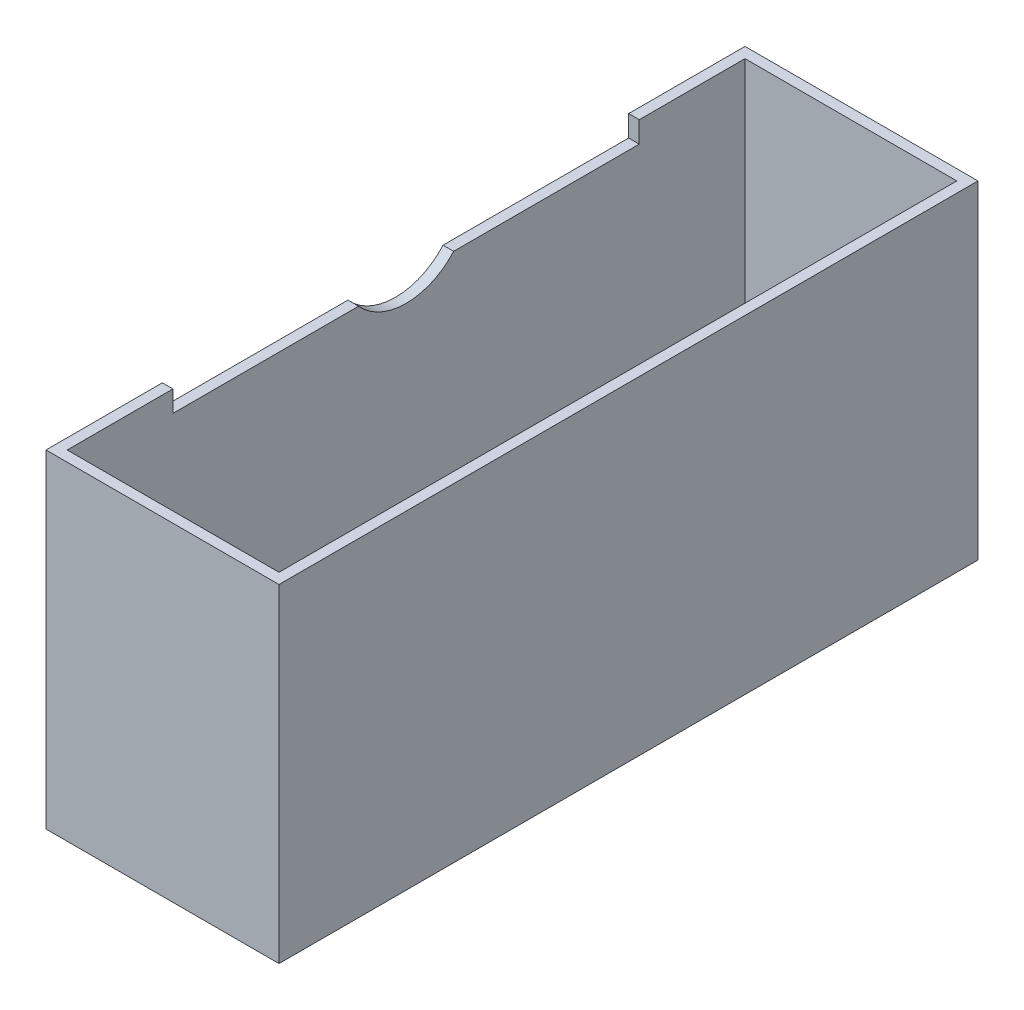
ISO-10303-21;
HEADER;
FILE_DESCRIPTION(('STEP AP214'),'2;1');
FILE_NAME('part.step','',(''),(''),'','','');
FILE_SCHEMA(('AUTOMOTIVE_DESIGN { 1 0 10303 214 1 1 1 1 }'));
ENDSEC;
DATA;
#1=APPLICATION_CONTEXT('core data for automotive mechanical design processes');
#2=APPLICATION_PROTOCOL_DEFINITION('international standard','automotive_design',2000,#1);
#3=PRODUCT_CONTEXT('',#1,'mechanical');
#4=PRODUCT('Part','Part','',(#3));
#5=PRODUCT_RELATED_PRODUCT_CATEGORY('part','',(#4));
#6=PRODUCT_DEFINITION_FORMATION('','',#4);
#7=PRODUCT_DEFINITION_CONTEXT('part definition',#1,'design');
#8=PRODUCT_DEFINITION('design','',#6,#7);
#9=PRODUCT_DEFINITION_SHAPE('','',#8);
#10=(LENGTH_UNIT() NAMED_UNIT(*) SI_UNIT(.MILLI.,.METRE.));
#11=(NAMED_UNIT(*) PLANE_ANGLE_UNIT() SI_UNIT($,.RADIAN.));
#12=(NAMED_UNIT(*) SI_UNIT($,.STERADIAN.) SOLID_ANGLE_UNIT());
#13=UNCERTAINTY_MEASURE_WITH_UNIT(LENGTH_MEASURE(1.E-05),#10,'distance_accuracy_value','');
#14=(GEOMETRIC_REPRESENTATION_CONTEXT(3) GLOBAL_UNCERTAINTY_ASSIGNED_CONTEXT((#13)) GLOBAL_UNIT_ASSIGNED_CONTEXT((#10,
#11,#12)) REPRESENTATION_CONTEXT('',''));
#15=CARTESIAN_POINT('',(0.,0.,0.));
#16=DIRECTION('',(0.,0.,1.));
#17=DIRECTION('',(1.,0.,0.));
#18=AXIS2_PLACEMENT_3D('',#15,#16,#17);
#19=CARTESIAN_POINT('',(34.925,98.425,-104.775));
#20=DIRECTION('',(-1.,0.,0.));
#21=DIRECTION('',(0.,0.,1.));
#22=AXIS2_PLACEMENT_3D('',#19,#20,#21);
#23=PLANE('',#22);
#24=DIRECTION('',(0.,0.,-1.));
#25=VECTOR('',#24,1.);
#26=CARTESIAN_POINT('',(34.925,0.,-104.775));
#27=LINE('',#26,#25);
#28=CARTESIAN_POINT('',(34.9250000000001,0.,104.775));
#29=VERTEX_POINT('',#28);
#30=CARTESIAN_POINT('',(34.925,0.,-104.775));
#31=VERTEX_POINT('',#30);
#32=EDGE_CURVE('E236',#29,#31,#27,.T.);
#33=ORIENTED_EDGE('',*,*,#32,.T.);
#34=DIRECTION('',(0.,-1.,0.));
#35=VECTOR('',#34,1.);
#36=CARTESIAN_POINT('',(34.925,98.425,-104.775));
#37=LINE('',#36,#35);
#38=CARTESIAN_POINT('',(34.925,98.425,-104.775));
#39=VERTEX_POINT('',#38);
#40=EDGE_CURVE('E49',#39,#31,#37,.T.);
#41=ORIENTED_EDGE('',*,*,#40,.F.);
#42=DIRECTION('',(0.,0.,-1.));
#43=VECTOR('',#42,1.);
#44=CARTESIAN_POINT('',(34.925,98.425,-104.775));
#45=LINE('',#44,#43);
#46=CARTESIAN_POINT('',(34.9250000000001,98.425,104.775));
#47=VERTEX_POINT('',#46);
#48=EDGE_CURVE('E237',#47,#39,#45,.T.);
#49=ORIENTED_EDGE('',*,*,#48,.F.);
#50=DIRECTION('',(0.,-1.,0.));
#51=VECTOR('',#50,1.);
#52=CARTESIAN_POINT('',(34.9250000000001,98.425,104.775));
#53=LINE('',#52,#51);
#54=EDGE_CURVE('E252',#47,#29,#53,.T.);
#55=ORIENTED_EDGE('',*,*,#54,.T.);
#56=EDGE_LOOP('',(#33,#41,#49,#55));
#57=FACE_BOUND('',#56,.T.);
#58=ADVANCED_FACE('F41',(#57),#23,.F.);
#59=CARTESIAN_POINT('',(-34.925,98.425,-104.775));
#60=DIRECTION('',(0.,0.,1.));
#61=DIRECTION('',(1.,0.,0.));
#62=AXIS2_PLACEMENT_3D('',#59,#60,#61);
#63=PLANE('',#62);
#64=DIRECTION('',(-1.,0.,0.));
#65=VECTOR('',#64,1.);
#66=CARTESIAN_POINT('',(-34.925,0.,-104.775));
#67=LINE('',#66,#65);
#68=CARTESIAN_POINT('',(-34.925,0.,-104.775));
#69=VERTEX_POINT('',#68);
#70=EDGE_CURVE('E256',#31,#69,#67,.T.);
#71=ORIENTED_EDGE('',*,*,#70,.T.);
#72=DIRECTION('',(0.,-1.,0.));
#73=VECTOR('',#72,1.);
#74=CARTESIAN_POINT('',(-34.925,98.425,-104.775));
#75=LINE('',#74,#73);
#76=CARTESIAN_POINT('',(-34.925,98.425,-104.775));
#77=VERTEX_POINT('',#76);
#78=EDGE_CURVE('E271',#77,#69,#75,.T.);
#79=ORIENTED_EDGE('',*,*,#78,.F.);
#80=DIRECTION('',(-1.,0.,0.));
#81=VECTOR('',#80,1.);
#82=CARTESIAN_POINT('',(-34.925,98.425,-104.775));
#83=LINE('',#82,#81);
#84=EDGE_CURVE('E241',#39,#77,#83,.T.);
#85=ORIENTED_EDGE('',*,*,#84,.F.);
#86=ORIENTED_EDGE('',*,*,#40,.T.);
#87=EDGE_LOOP('',(#71,#79,#85,#86));
#88=FACE_BOUND('',#87,.T.);
#89=ADVANCED_FACE('F278',(#88),#63,.F.);
#90=CARTESIAN_POINT('',(-34.925,98.425,-104.775));
#91=DIRECTION('',(1.,0.,0.));
#92=DIRECTION('',(0.,0.,-1.));
#93=AXIS2_PLACEMENT_3D('',#90,#91,#92);
#94=PLANE('',#93);
#95=DIRECTION('',(0.,0.,1.));
#96=VECTOR('',#95,1.);
#97=CARTESIAN_POINT('',(-34.925,98.425,-104.775));
#98=LINE('',#97,#96);
#99=CARTESIAN_POINT('',(-34.9249999999999,98.425,69.8969947717208));
#100=VERTEX_POINT('',#99);
#101=CARTESIAN_POINT('',(-34.9249999999999,98.425,104.775));
#102=VERTEX_POINT('',#101);
#103=EDGE_CURVE('E245',#100,#102,#98,.T.);
#104=ORIENTED_EDGE('',*,*,#103,.F.);
#105=DIRECTION('',(0.,1.,0.));
#106=VECTOR('',#105,1.);
#107=CARTESIAN_POINT('',(-34.9249999999999,92.075,69.8969947717208));
#108=LINE('',#107,#106);
#109=CARTESIAN_POINT('',(-34.9249999999999,92.075,69.8969947717208));
#110=VERTEX_POINT('',#109);
#111=EDGE_CURVE('E162',#110,#100,#108,.T.);
#112=ORIENTED_EDGE('',*,*,#111,.F.);
#113=DIRECTION('',(0.,0.,1.));
#114=VECTOR('',#113,1.);
#115=CARTESIAN_POINT('',(-34.925,92.075,14.2460264288444));
#116=LINE('',#115,#114);
#117=CARTESIAN_POINT('',(-34.925,92.075,14.2460264288444));
#118=VERTEX_POINT('',#117);
#119=EDGE_CURVE('E172',#118,#110,#116,.T.);
#120=ORIENTED_EDGE('',*,*,#119,.F.);
#121=CARTESIAN_POINT('',(-34.925,104.72226179806,0.));
#122=DIRECTION('',(-1.,0.,0.));
#123=DIRECTION('',(0.,0.,1.));
#124=AXIS2_PLACEMENT_3D('',#121,#122,#123);
#125=CIRCLE('',#124,19.05);
#126=CARTESIAN_POINT('',(-34.925,92.075,-14.2460264288444));
#127=VERTEX_POINT('',#126);
#128=EDGE_CURVE('E168',#127,#118,#125,.T.);
#129=ORIENTED_EDGE('',*,*,#128,.F.);
#130=DIRECTION('',(0.,0.,1.));
#131=VECTOR('',#130,1.);
#132=CARTESIAN_POINT('',(-34.925,92.075,-69.8969947717208));
#133=LINE('',#132,#131);
#134=CARTESIAN_POINT('',(-34.925,92.075,-69.8969947717208));
#135=VERTEX_POINT('',#134);
#136=EDGE_CURVE('E150',#135,#127,#133,.T.);
#137=ORIENTED_EDGE('',*,*,#136,.F.);
#138=DIRECTION('',(0.,-1.,0.));
#139=VECTOR('',#138,1.);
#140=CARTESIAN_POINT('',(-34.925,98.425,-69.8969947717208));
#141=LINE('',#140,#139);
#142=CARTESIAN_POINT('',(-34.925,98.425,-69.8969947717208));
#143=VERTEX_POINT('',#142);
#144=EDGE_CURVE('E141',#143,#135,#141,.T.);
#145=ORIENTED_EDGE('',*,*,#144,.F.);
#146=EDGE_CURVE('E246',#77,#143,#98,.T.);
#147=ORIENTED_EDGE('',*,*,#146,.F.);
#148=ORIENTED_EDGE('',*,*,#78,.T.);
#149=DIRECTION('',(0.,0.,1.));
#150=VECTOR('',#149,1.);
#151=CARTESIAN_POINT('',(-34.925,0.,-104.775));
#152=LINE('',#151,#150);
#153=CARTESIAN_POINT('',(-34.9249999999999,0.,104.775));
#154=VERTEX_POINT('',#153);
#155=EDGE_CURVE('E259',#69,#154,#152,.T.);
#156=ORIENTED_EDGE('',*,*,#155,.T.);
#157=DIRECTION('',(0.,-1.,0.));
#158=VECTOR('',#157,1.);
#159=CARTESIAN_POINT('',(-34.9249999999999,98.425,104.775));
#160=LINE('',#159,#158);
#161=EDGE_CURVE('E267',#102,#154,#160,.T.);
#162=ORIENTED_EDGE('',*,*,#161,.F.);
#163=EDGE_LOOP('',(#104,#112,#120,#129,#137,#145,#147,#148,#156,#162));
#164=FACE_BOUND('',#163,.T.);
#165=ADVANCED_FACE('F165',(#164),#94,.F.);
#166=CARTESIAN_POINT('',(-34.9249999999999,98.425,104.775));
#167=DIRECTION('',(0.,0.,-1.));
#168=DIRECTION('',(-1.,0.,0.));
#169=AXIS2_PLACEMENT_3D('',#166,#167,#168);
#170=PLANE('',#169);
#171=DIRECTION('',(1.,0.,0.));
#172=VECTOR('',#171,1.);
#173=CARTESIAN_POINT('',(-34.9249999999999,0.,104.775));
#174=LINE('',#173,#172);
#175=EDGE_CURVE('E242',#154,#29,#174,.T.);
#176=ORIENTED_EDGE('',*,*,#175,.T.);
#177=ORIENTED_EDGE('',*,*,#54,.F.);
#178=DIRECTION('',(1.,0.,0.));
#179=VECTOR('',#178,1.);
#180=CARTESIAN_POINT('',(-34.9249999999999,98.425,104.775));
#181=LINE('',#180,#179);
#182=EDGE_CURVE('E249',#102,#47,#181,.T.);
#183=ORIENTED_EDGE('',*,*,#182,.F.);
#184=ORIENTED_EDGE('',*,*,#161,.T.);
#185=EDGE_LOOP('',(#176,#177,#183,#184));
#186=FACE_BOUND('',#185,.T.);
#187=ADVANCED_FACE('F291',(#186),#170,.F.);
#188=CARTESIAN_POINT('',(0.,98.425,0.));
#189=DIRECTION('',(0.,1.,0.));
#190=DIRECTION('',(0.,0.,1.));
#191=AXIS2_PLACEMENT_3D('',#188,#189,#190);
#192=PLANE('',#191);
#193=DIRECTION('',(1.,0.,0.));
#194=VECTOR('',#193,1.);
#195=CARTESIAN_POINT('',(0.,98.425,69.8969947717208));
#196=LINE('',#195,#194);
#197=CARTESIAN_POINT('',(-31.75,98.425,69.8969947717208));
#198=VERTEX_POINT('',#197);
#199=EDGE_CURVE('E192',#100,#198,#196,.T.);
#200=ORIENTED_EDGE('',*,*,#199,.F.);
#201=ORIENTED_EDGE('',*,*,#103,.T.);
#202=ORIENTED_EDGE('',*,*,#182,.T.);
#203=ORIENTED_EDGE('',*,*,#48,.T.);
#204=ORIENTED_EDGE('',*,*,#84,.T.);
#205=ORIENTED_EDGE('',*,*,#146,.T.);
#206=DIRECTION('',(-1.,0.,0.));
#207=VECTOR('',#206,1.);
#208=CARTESIAN_POINT('',(0.,98.425,-69.8969947717208));
#209=LINE('',#208,#207);
#210=CARTESIAN_POINT('',(-31.75,98.425,-69.8969947717208));
#211=VERTEX_POINT('',#210);
#212=EDGE_CURVE('E144',#211,#143,#209,.T.);
#213=ORIENTED_EDGE('',*,*,#212,.F.);
#214=DIRECTION('',(0.,0.,1.));
#215=VECTOR('',#214,1.);
#216=CARTESIAN_POINT('',(-31.75,98.425,101.6));
#217=LINE('',#216,#215);
#218=CARTESIAN_POINT('',(-31.75,98.425,-101.6));
#219=VERTEX_POINT('',#218);
#220=EDGE_CURVE('E214',#219,#211,#217,.T.);
#221=ORIENTED_EDGE('',*,*,#220,.F.);
#222=DIRECTION('',(-1.,0.,0.));
#223=VECTOR('',#222,1.);
#224=CARTESIAN_POINT('',(-31.75,98.425,-101.6));
#225=LINE('',#224,#223);
#226=CARTESIAN_POINT('',(31.75,98.425,-101.6));
#227=VERTEX_POINT('',#226);
#228=EDGE_CURVE('E209',#227,#219,#225,.T.);
#229=ORIENTED_EDGE('',*,*,#228,.F.);
#230=DIRECTION('',(0.,0.,-1.));
#231=VECTOR('',#230,1.);
#232=CARTESIAN_POINT('',(31.75,98.425,101.6));
#233=LINE('',#232,#231);
#234=CARTESIAN_POINT('',(31.75,98.425,101.6));
#235=VERTEX_POINT('',#234);
#236=EDGE_CURVE('E64',#235,#227,#233,.T.);
#237=ORIENTED_EDGE('',*,*,#236,.F.);
#238=DIRECTION('',(1.,0.,0.));
#239=VECTOR('',#238,1.);
#240=CARTESIAN_POINT('',(-31.75,98.425,101.6));
#241=LINE('',#240,#239);
#242=CARTESIAN_POINT('',(-31.75,98.425,101.6));
#243=VERTEX_POINT('',#242);
#244=EDGE_CURVE('E218',#243,#235,#241,.T.);
#245=ORIENTED_EDGE('',*,*,#244,.F.);
#246=EDGE_CURVE('E213',#198,#243,#217,.T.);
#247=ORIENTED_EDGE('',*,*,#246,.F.);
#248=EDGE_LOOP('',(#200,#201,#202,#203,#204,#205,#213,#221,#229,#237,#245,#247));
#249=FACE_BOUND('',#248,.T.);
#250=ADVANCED_FACE('F294',(#249),#192,.T.);
#251=CARTESIAN_POINT('',(0.,0.,0.));
#252=DIRECTION('',(0.,1.,0.));
#253=DIRECTION('',(0.,0.,1.));
#254=AXIS2_PLACEMENT_3D('',#251,#252,#253);
#255=PLANE('',#254);
#256=ORIENTED_EDGE('',*,*,#32,.F.);
#257=ORIENTED_EDGE('',*,*,#175,.F.);
#258=ORIENTED_EDGE('',*,*,#155,.F.);
#259=ORIENTED_EDGE('',*,*,#70,.F.);
#260=EDGE_LOOP('',(#256,#257,#258,#259));
#261=FACE_BOUND('',#260,.T.);
#262=ADVANCED_FACE('F286',(#261),#255,.F.);
#263=CARTESIAN_POINT('',(31.75,-212.890793600851,101.6));
#264=DIRECTION('',(1.,0.,0.));
#265=DIRECTION('',(0.,0.,-1.));
#266=AXIS2_PLACEMENT_3D('',#263,#264,#265);
#267=PLANE('',#266);
#268=DIRECTION('',(0.,0.,1.));
#269=VECTOR('',#268,1.);
#270=CARTESIAN_POINT('',(31.75,3.17500000000001,101.6));
#271=LINE('',#270,#269);
#272=CARTESIAN_POINT('',(31.75,3.17500000000001,-101.6));
#273=VERTEX_POINT('',#272);
#274=CARTESIAN_POINT('',(31.75,3.17500000000001,101.6));
#275=VERTEX_POINT('',#274);
#276=EDGE_CURVE('E203',#273,#275,#271,.T.);
#277=ORIENTED_EDGE('',*,*,#276,.T.);
#278=DIRECTION('',(0.,1.,0.));
#279=VECTOR('',#278,1.);
#280=CARTESIAN_POINT('',(31.75,-212.890793600851,101.6));
#281=LINE('',#280,#279);
#282=EDGE_CURVE('E200',#275,#235,#281,.T.);
#283=ORIENTED_EDGE('',*,*,#282,.T.);
#284=ORIENTED_EDGE('',*,*,#236,.T.);
#285=DIRECTION('',(0.,1.,0.));
#286=VECTOR('',#285,1.);
#287=CARTESIAN_POINT('',(31.75,-212.890793600851,-101.6));
#288=LINE('',#287,#286);
#289=EDGE_CURVE('E222',#273,#227,#288,.T.);
#290=ORIENTED_EDGE('',*,*,#289,.F.);
#291=EDGE_LOOP('',(#277,#283,#284,#290));
#292=FACE_BOUND('',#291,.T.);
#293=ADVANCED_FACE('F353',(#292),#267,.F.);
#294=CARTESIAN_POINT('',(-31.75,-212.890793600851,101.6));
#295=DIRECTION('',(0.,0.,1.));
#296=DIRECTION('',(1.,0.,0.));
#297=AXIS2_PLACEMENT_3D('',#294,#295,#296);
#298=PLANE('',#297);
#299=DIRECTION('',(-1.,0.,0.));
#300=VECTOR('',#299,1.);
#301=CARTESIAN_POINT('',(-31.75,3.17500000000001,101.6));
#302=LINE('',#301,#300);
#303=CARTESIAN_POINT('',(-31.75,3.17500000000001,101.6));
#304=VERTEX_POINT('',#303);
#305=EDGE_CURVE('E199',#275,#304,#302,.T.);
#306=ORIENTED_EDGE('',*,*,#305,.T.);
#307=DIRECTION('',(0.,1.,0.));
#308=VECTOR('',#307,1.);
#309=CARTESIAN_POINT('',(-31.75,-212.890793600851,101.6));
#310=LINE('',#309,#308);
#311=EDGE_CURVE('E225',#304,#243,#310,.T.);
#312=ORIENTED_EDGE('',*,*,#311,.T.);
#313=ORIENTED_EDGE('',*,*,#244,.T.);
#314=ORIENTED_EDGE('',*,*,#282,.F.);
#315=EDGE_LOOP('',(#306,#312,#313,#314));
#316=FACE_BOUND('',#315,.T.);
#317=ADVANCED_FACE('F321',(#316),#298,.F.);
#318=CARTESIAN_POINT('',(-31.75,-212.890793600851,101.6));
#319=DIRECTION('',(-1.,0.,0.));
#320=DIRECTION('',(0.,0.,1.));
#321=AXIS2_PLACEMENT_3D('',#318,#319,#320);
#322=PLANE('',#321);
#323=DIRECTION('',(0.,0.,-1.));
#324=VECTOR('',#323,1.);
#325=CARTESIAN_POINT('',(-31.75,92.075,14.2460264288444));
#326=LINE('',#325,#324);
#327=CARTESIAN_POINT('',(-31.75,92.075,69.8969947717208));
#328=VERTEX_POINT('',#327);
#329=CARTESIAN_POINT('',(-31.75,92.075,14.2460264288444));
#330=VERTEX_POINT('',#329);
#331=EDGE_CURVE('E193',#328,#330,#326,.T.);
#332=ORIENTED_EDGE('',*,*,#331,.F.);
#333=DIRECTION('',(0.,1.,0.));
#334=VECTOR('',#333,1.);
#335=CARTESIAN_POINT('',(-31.75,-212.890793600851,69.8969947717208));
#336=LINE('',#335,#334);
#337=EDGE_CURVE('E12',#328,#198,#336,.T.);
#338=ORIENTED_EDGE('',*,*,#337,.T.);
#339=ORIENTED_EDGE('',*,*,#246,.T.);
#340=ORIENTED_EDGE('',*,*,#311,.F.);
#341=DIRECTION('',(0.,0.,-1.));
#342=VECTOR('',#341,1.);
#343=CARTESIAN_POINT('',(-31.75,3.17500000000001,101.6));
#344=LINE('',#343,#342);
#345=CARTESIAN_POINT('',(-31.75,3.17500000000001,-101.6));
#346=VERTEX_POINT('',#345);
#347=EDGE_CURVE('E196',#304,#346,#344,.T.);
#348=ORIENTED_EDGE('',*,*,#347,.T.);
#349=DIRECTION('',(0.,1.,0.));
#350=VECTOR('',#349,1.);
#351=CARTESIAN_POINT('',(-31.75,-212.890793600851,-101.6));
#352=LINE('',#351,#350);
#353=EDGE_CURVE('E229',#346,#219,#352,.T.);
#354=ORIENTED_EDGE('',*,*,#353,.T.);
#355=ORIENTED_EDGE('',*,*,#220,.T.);
#356=DIRECTION('',(0.,1.,0.));
#357=VECTOR('',#356,1.);
#358=CARTESIAN_POINT('',(-31.75,98.425,-69.8969947717208));
#359=LINE('',#358,#357);
#360=CARTESIAN_POINT('',(-31.75,92.075,-69.8969947717208));
#361=VERTEX_POINT('',#360);
#362=EDGE_CURVE('E184',#361,#211,#359,.T.);
#363=ORIENTED_EDGE('',*,*,#362,.F.);
#364=DIRECTION('',(0.,0.,-1.));
#365=VECTOR('',#364,1.);
#366=CARTESIAN_POINT('',(-31.75,92.075,-69.8969947717209));
#367=LINE('',#366,#365);
#368=CARTESIAN_POINT('',(-31.75,92.075,-14.2460264288444));
#369=VERTEX_POINT('',#368);
#370=EDGE_CURVE('E158',#369,#361,#367,.T.);
#371=ORIENTED_EDGE('',*,*,#370,.F.);
#372=CARTESIAN_POINT('',(-31.75,104.72226179806,0.));
#373=DIRECTION('',(-1.,0.,0.));
#374=DIRECTION('',(0.,0.,1.));
#375=AXIS2_PLACEMENT_3D('',#372,#373,#374);
#376=CIRCLE('',#375,19.05);
#377=EDGE_CURVE('E301',#330,#369,#376,.F.);
#378=ORIENTED_EDGE('',*,*,#377,.F.);
#379=EDGE_LOOP('',(#332,#338,#339,#340,#348,#354,#355,#363,#371,#378));
#380=FACE_BOUND('',#379,.T.);
#381=ADVANCED_FACE('F311',(#380),#322,.F.);
#382=CARTESIAN_POINT('',(-31.75,-212.890793600851,-101.6));
#383=DIRECTION('',(0.,0.,-1.));
#384=DIRECTION('',(-1.,0.,0.));
#385=AXIS2_PLACEMENT_3D('',#382,#383,#384);
#386=PLANE('',#385);
#387=DIRECTION('',(1.,0.,0.));
#388=VECTOR('',#387,1.);
#389=CARTESIAN_POINT('',(-31.75,3.17500000000001,-101.6));
#390=LINE('',#389,#388);
#391=EDGE_CURVE('E206',#346,#273,#390,.T.);
#392=ORIENTED_EDGE('',*,*,#391,.T.);
#393=ORIENTED_EDGE('',*,*,#289,.T.);
#394=ORIENTED_EDGE('',*,*,#228,.T.);
#395=ORIENTED_EDGE('',*,*,#353,.F.);
#396=EDGE_LOOP('',(#392,#393,#394,#395));
#397=FACE_BOUND('',#396,.T.);
#398=ADVANCED_FACE('F317',(#397),#386,.F.);
#399=CARTESIAN_POINT('',(0.,3.175,0.));
#400=DIRECTION('',(0.,1.,0.));
#401=DIRECTION('',(0.,0.,1.));
#402=AXIS2_PLACEMENT_3D('',#399,#400,#401);
#403=PLANE('',#402);
#404=ORIENTED_EDGE('',*,*,#276,.F.);
#405=ORIENTED_EDGE('',*,*,#391,.F.);
#406=ORIENTED_EDGE('',*,*,#347,.F.);
#407=ORIENTED_EDGE('',*,*,#305,.F.);
#408=EDGE_LOOP('',(#404,#405,#406,#407));
#409=FACE_BOUND('',#408,.T.);
#410=ADVANCED_FACE('F360',(#409),#403,.T.);
#411=CARTESIAN_POINT('',(135.840372984362,92.075,69.8969947717208));
#412=DIRECTION('',(0.,0.,1.));
#413=DIRECTION('',(1.,0.,0.));
#414=AXIS2_PLACEMENT_3D('',#411,#412,#413);
#415=PLANE('',#414);
#416=ORIENTED_EDGE('',*,*,#199,.T.);
#417=ORIENTED_EDGE('',*,*,#337,.F.);
#418=DIRECTION('',(-1.,0.,0.));
#419=VECTOR('',#418,1.);
#420=CARTESIAN_POINT('',(135.840372984362,92.075,69.8969947717208));
#421=LINE('',#420,#419);
#422=EDGE_CURVE('E181',#328,#110,#421,.T.);
#423=ORIENTED_EDGE('',*,*,#422,.T.);
#424=ORIENTED_EDGE('',*,*,#111,.T.);
#425=EDGE_LOOP('',(#416,#417,#423,#424));
#426=FACE_BOUND('',#425,.T.);
#427=ADVANCED_FACE('F326',(#426),#415,.F.);
#428=CARTESIAN_POINT('',(135.840372984362,92.075,14.2460264288444));
#429=DIRECTION('',(0.,-1.,0.));
#430=DIRECTION('',(0.,0.,-1.));
#431=AXIS2_PLACEMENT_3D('',#428,#429,#430);
#432=PLANE('',#431);
#433=ORIENTED_EDGE('',*,*,#331,.T.);
#434=DIRECTION('',(-1.,0.,0.));
#435=VECTOR('',#434,1.);
#436=CARTESIAN_POINT('',(135.840372984362,92.075,14.2460264288444));
#437=LINE('',#436,#435);
#438=EDGE_CURVE('E185',#330,#118,#437,.T.);
#439=ORIENTED_EDGE('',*,*,#438,.T.);
#440=ORIENTED_EDGE('',*,*,#119,.T.);
#441=ORIENTED_EDGE('',*,*,#422,.F.);
#442=EDGE_LOOP('',(#433,#439,#440,#441));
#443=FACE_BOUND('',#442,.T.);
#444=ADVANCED_FACE('F328',(#443),#432,.F.);
#445=CARTESIAN_POINT('',(135.840372984362,104.72226179806,0.));
#446=DIRECTION('',(-1.,0.,0.));
#447=DIRECTION('',(0.,0.,1.));
#448=AXIS2_PLACEMENT_3D('',#445,#446,#447);
#449=CYLINDRICAL_SURFACE('',#448,19.05);
#450=ORIENTED_EDGE('',*,*,#377,.T.);
#451=DIRECTION('',(-1.,0.,0.));
#452=VECTOR('',#451,1.);
#453=CARTESIAN_POINT('',(135.840372984362,92.075,-14.2460264288445));
#454=LINE('',#453,#452);
#455=EDGE_CURVE('E161',#369,#127,#454,.T.);
#456=ORIENTED_EDGE('',*,*,#455,.T.);
#457=ORIENTED_EDGE('',*,*,#128,.T.);
#458=ORIENTED_EDGE('',*,*,#438,.F.);
#459=EDGE_LOOP('',(#450,#456,#457,#458));
#460=FACE_BOUND('',#459,.T.);
#461=ADVANCED_FACE('F331',(#460),#449,.F.);
#462=CARTESIAN_POINT('',(135.840372984362,92.075,-69.8969947717209));
#463=DIRECTION('',(0.,-1.,0.));
#464=DIRECTION('',(0.,0.,-1.));
#465=AXIS2_PLACEMENT_3D('',#462,#463,#464);
#466=PLANE('',#465);
#467=ORIENTED_EDGE('',*,*,#370,.T.);
#468=DIRECTION('',(-1.,0.,0.));
#469=VECTOR('',#468,1.);
#470=CARTESIAN_POINT('',(135.840372984362,92.075,-69.8969947717209));
#471=LINE('',#470,#469);
#472=EDGE_CURVE('E56',#361,#135,#471,.T.);
#473=ORIENTED_EDGE('',*,*,#472,.T.);
#474=ORIENTED_EDGE('',*,*,#136,.T.);
#475=ORIENTED_EDGE('',*,*,#455,.F.);
#476=EDGE_LOOP('',(#467,#473,#474,#475));
#477=FACE_BOUND('',#476,.T.);
#478=ADVANCED_FACE('F154',(#477),#466,.F.);
#479=CARTESIAN_POINT('',(135.840372984362,98.425,-69.8969947717209));
#480=DIRECTION('',(0.,0.,-1.));
#481=DIRECTION('',(-1.,0.,0.));
#482=AXIS2_PLACEMENT_3D('',#479,#480,#481);
#483=PLANE('',#482);
#484=ORIENTED_EDGE('',*,*,#212,.T.);
#485=ORIENTED_EDGE('',*,*,#144,.T.);
#486=ORIENTED_EDGE('',*,*,#472,.F.);
#487=ORIENTED_EDGE('',*,*,#362,.T.);
#488=EDGE_LOOP('',(#484,#485,#486,#487));
#489=FACE_BOUND('',#488,.T.);
#490=ADVANCED_FACE('F142',(#489),#483,.F.);
#491=CLOSED_SHELL('',(#58,#89,#165,#187,#250,#262,#293,#317,#381,#398,#410,#427,#444,#461,#478,#490));
#492=MANIFOLD_SOLID_BREP('B2',#491);
#493=ADVANCED_BREP_SHAPE_REPRESENTATION('',(#18,#492),#14);
#494=SHAPE_DEFINITION_REPRESENTATION(#9,#493);
ENDSEC;
END-ISO-10303-21;
